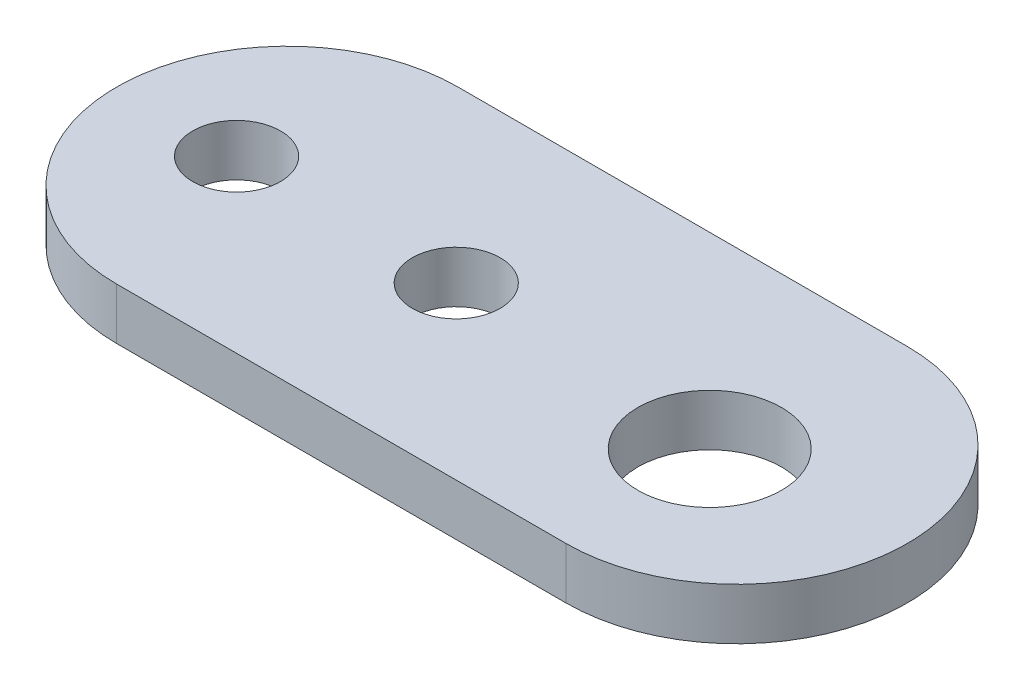
ISO-10303-21;
HEADER;
FILE_DESCRIPTION(('STEP AP214'),'2;1');
FILE_NAME('part.step','',(''),(''),'','','');
FILE_SCHEMA(('AUTOMOTIVE_DESIGN { 1 0 10303 214 1 1 1 1 }'));
ENDSEC;
DATA;
#1=APPLICATION_CONTEXT('core data for automotive mechanical design processes');
#2=APPLICATION_PROTOCOL_DEFINITION('international standard','automotive_design',2000,#1);
#3=PRODUCT_CONTEXT('',#1,'mechanical');
#4=PRODUCT('Part','Part','',(#3));
#5=PRODUCT_RELATED_PRODUCT_CATEGORY('part','',(#4));
#6=PRODUCT_DEFINITION_FORMATION('','',#4);
#7=PRODUCT_DEFINITION_CONTEXT('part definition',#1,'design');
#8=PRODUCT_DEFINITION('design','',#6,#7);
#9=PRODUCT_DEFINITION_SHAPE('','',#8);
#10=(LENGTH_UNIT() NAMED_UNIT(*) SI_UNIT(.MILLI.,.METRE.));
#11=(NAMED_UNIT(*) PLANE_ANGLE_UNIT() SI_UNIT($,.RADIAN.));
#12=(NAMED_UNIT(*) SI_UNIT($,.STERADIAN.) SOLID_ANGLE_UNIT());
#13=UNCERTAINTY_MEASURE_WITH_UNIT(LENGTH_MEASURE(1.E-05),#10,'distance_accuracy_value','');
#14=(GEOMETRIC_REPRESENTATION_CONTEXT(3) GLOBAL_UNCERTAINTY_ASSIGNED_CONTEXT((#13)) GLOBAL_UNIT_ASSIGNED_CONTEXT((#10,
#11,#12)) REPRESENTATION_CONTEXT('',''));
#15=CARTESIAN_POINT('',(0.,0.,0.));
#16=DIRECTION('',(0.,0.,1.));
#17=DIRECTION('',(1.,0.,0.));
#18=AXIS2_PLACEMENT_3D('',#15,#16,#17);
#19=CARTESIAN_POINT('',(13.3,0.,0.));
#20=DIRECTION('',(0.,1.,0.));
#21=DIRECTION('',(1.,0.,0.));
#22=AXIS2_PLACEMENT_3D('',#19,#20,#21);
#23=PLANE('',#22);
#24=CARTESIAN_POINT('',(-3.,0.,0.));
#25=DIRECTION('',(0.,-1.,0.));
#26=DIRECTION('',(1.,0.,0.));
#27=AXIS2_PLACEMENT_3D('',#24,#25,#26);
#28=CIRCLE('',#27,2.6);
#29=CARTESIAN_POINT('',(-5.6,0.,0.));
#30=VERTEX_POINT('',#29);
#31=EDGE_CURVE('E121',#30,#30,#28,.T.);
#32=ORIENTED_EDGE('',*,*,#31,.F.);
#33=EDGE_LOOP('',(#32));
#34=FACE_BOUND('',#33,.T.);
#35=CARTESIAN_POINT('',(10.,0.,0.));
#36=DIRECTION('',(0.,-1.,0.));
#37=DIRECTION('',(1.,0.,0.));
#38=AXIS2_PLACEMENT_3D('',#35,#36,#37);
#39=CIRCLE('',#38,2.6);
#40=CARTESIAN_POINT('',(7.4,0.,0.));
#41=VERTEX_POINT('',#40);
#42=EDGE_CURVE('E116',#41,#41,#39,.T.);
#43=ORIENTED_EDGE('',*,*,#42,.F.);
#44=EDGE_LOOP('',(#43));
#45=FACE_BOUND('',#44,.T.);
#46=CARTESIAN_POINT('',(26.,0.,1.));
#47=DIRECTION('',(0.,-1.,0.));
#48=DIRECTION('',(1.,0.,0.));
#49=AXIS2_PLACEMENT_3D('',#46,#47,#48);
#50=CIRCLE('',#49,4.25);
#51=CARTESIAN_POINT('',(21.75,0.,1.));
#52=VERTEX_POINT('',#51);
#53=EDGE_CURVE('E140',#52,#52,#50,.T.);
#54=ORIENTED_EDGE('',*,*,#53,.F.);
#55=EDGE_LOOP('',(#54));
#56=FACE_BOUND('',#55,.T.);
#57=CARTESIAN_POINT('',(0.,0.,0.));
#58=DIRECTION('',(0.,1.,0.));
#59=DIRECTION('',(0.,0.,-1.));
#60=AXIS2_PLACEMENT_3D('',#57,#58,#59);
#61=CIRCLE('',#60,10.1);
#62=CARTESIAN_POINT('',(0.,0.,-10.1));
#63=VERTEX_POINT('',#62);
#64=CARTESIAN_POINT('',(0.,0.,10.1));
#65=VERTEX_POINT('',#64);
#66=EDGE_CURVE('E27',#63,#65,#61,.T.);
#67=ORIENTED_EDGE('',*,*,#66,.F.);
#68=DIRECTION('',(-1.,0.,0.));
#69=VECTOR('',#68,1.);
#70=CARTESIAN_POINT('',(26.6,0.,-10.1));
#71=LINE('',#70,#69);
#72=CARTESIAN_POINT('',(26.6,0.,-10.1));
#73=VERTEX_POINT('',#72);
#74=EDGE_CURVE('E126',#73,#63,#71,.T.);
#75=ORIENTED_EDGE('',*,*,#74,.F.);
#76=CARTESIAN_POINT('',(26.6,0.,0.));
#77=DIRECTION('',(0.,1.,0.));
#78=DIRECTION('',(0.,0.,1.));
#79=AXIS2_PLACEMENT_3D('',#76,#77,#78);
#80=CIRCLE('',#79,10.1);
#81=CARTESIAN_POINT('',(26.6,0.,10.1));
#82=VERTEX_POINT('',#81);
#83=EDGE_CURVE('E105',#82,#73,#80,.T.);
#84=ORIENTED_EDGE('',*,*,#83,.F.);
#85=DIRECTION('',(1.,0.,0.));
#86=VECTOR('',#85,1.);
#87=CARTESIAN_POINT('',(0.,0.,10.1));
#88=LINE('',#87,#86);
#89=EDGE_CURVE('E89',#65,#82,#88,.T.);
#90=ORIENTED_EDGE('',*,*,#89,.F.);
#91=EDGE_LOOP('',(#67,#75,#84,#90));
#92=FACE_BOUND('',#91,.T.);
#93=ADVANCED_FACE('F16',(#34,#45,#56,#92),#23,.F.);
#94=CARTESIAN_POINT('',(13.3,3.05,0.));
#95=DIRECTION('',(0.,1.,0.));
#96=DIRECTION('',(1.,0.,0.));
#97=AXIS2_PLACEMENT_3D('',#94,#95,#96);
#98=PLANE('',#97);
#99=CARTESIAN_POINT('',(-3.,3.05,0.));
#100=DIRECTION('',(0.,-1.,0.));
#101=DIRECTION('',(1.,0.,0.));
#102=AXIS2_PLACEMENT_3D('',#99,#100,#101);
#103=CIRCLE('',#102,2.6);
#104=CARTESIAN_POINT('',(-5.6,3.05,0.));
#105=VERTEX_POINT('',#104);
#106=EDGE_CURVE('E120',#105,#105,#103,.T.);
#107=ORIENTED_EDGE('',*,*,#106,.T.);
#108=EDGE_LOOP('',(#107));
#109=FACE_BOUND('',#108,.T.);
#110=CARTESIAN_POINT('',(10.,3.05,0.));
#111=DIRECTION('',(0.,-1.,0.));
#112=DIRECTION('',(1.,0.,0.));
#113=AXIS2_PLACEMENT_3D('',#110,#111,#112);
#114=CIRCLE('',#113,2.6);
#115=CARTESIAN_POINT('',(7.4,3.05,0.));
#116=VERTEX_POINT('',#115);
#117=EDGE_CURVE('E144',#116,#116,#114,.T.);
#118=ORIENTED_EDGE('',*,*,#117,.T.);
#119=EDGE_LOOP('',(#118));
#120=FACE_BOUND('',#119,.T.);
#121=CARTESIAN_POINT('',(26.,3.05,1.));
#122=DIRECTION('',(0.,-1.,0.));
#123=DIRECTION('',(1.,0.,0.));
#124=AXIS2_PLACEMENT_3D('',#121,#122,#123);
#125=CIRCLE('',#124,4.25);
#126=CARTESIAN_POINT('',(21.75,3.05,1.));
#127=VERTEX_POINT('',#126);
#128=EDGE_CURVE('E130',#127,#127,#125,.T.);
#129=ORIENTED_EDGE('',*,*,#128,.T.);
#130=EDGE_LOOP('',(#129));
#131=FACE_BOUND('',#130,.T.);
#132=CARTESIAN_POINT('',(0.,3.05,0.));
#133=DIRECTION('',(0.,1.,0.));
#134=DIRECTION('',(0.,0.,-1.));
#135=AXIS2_PLACEMENT_3D('',#132,#133,#134);
#136=CIRCLE('',#135,10.1);
#137=CARTESIAN_POINT('',(0.,3.05,-10.1));
#138=VERTEX_POINT('',#137);
#139=CARTESIAN_POINT('',(0.,3.05,10.1));
#140=VERTEX_POINT('',#139);
#141=EDGE_CURVE('E11',#138,#140,#136,.T.);
#142=ORIENTED_EDGE('',*,*,#141,.T.);
#143=DIRECTION('',(1.,0.,0.));
#144=VECTOR('',#143,1.);
#145=CARTESIAN_POINT('',(0.,3.05,10.1));
#146=LINE('',#145,#144);
#147=CARTESIAN_POINT('',(26.6,3.05,10.1));
#148=VERTEX_POINT('',#147);
#149=EDGE_CURVE('E80',#140,#148,#146,.T.);
#150=ORIENTED_EDGE('',*,*,#149,.T.);
#151=CARTESIAN_POINT('',(26.6,3.05,0.));
#152=DIRECTION('',(0.,1.,0.));
#153=DIRECTION('',(0.,0.,1.));
#154=AXIS2_PLACEMENT_3D('',#151,#152,#153);
#155=CIRCLE('',#154,10.1);
#156=CARTESIAN_POINT('',(26.6,3.05,-10.1));
#157=VERTEX_POINT('',#156);
#158=EDGE_CURVE('E83',#148,#157,#155,.T.);
#159=ORIENTED_EDGE('',*,*,#158,.T.);
#160=DIRECTION('',(-1.,0.,0.));
#161=VECTOR('',#160,1.);
#162=CARTESIAN_POINT('',(26.6,3.05,-10.1));
#163=LINE('',#162,#161);
#164=EDGE_CURVE('E135',#157,#138,#163,.T.);
#165=ORIENTED_EDGE('',*,*,#164,.T.);
#166=EDGE_LOOP('',(#142,#150,#159,#165));
#167=FACE_BOUND('',#166,.T.);
#168=ADVANCED_FACE('F18',(#109,#120,#131,#167),#98,.T.);
#169=CARTESIAN_POINT('',(0.,0.,0.));
#170=DIRECTION('',(0.,1.,0.));
#171=DIRECTION('',(0.,0.,-1.));
#172=AXIS2_PLACEMENT_3D('',#169,#170,#171);
#173=CYLINDRICAL_SURFACE('',#172,10.1);
#174=ORIENTED_EDGE('',*,*,#66,.T.);
#175=DIRECTION('',(0.,1.,0.));
#176=VECTOR('',#175,1.);
#177=CARTESIAN_POINT('',(0.,0.,10.1));
#178=LINE('',#177,#176);
#179=EDGE_CURVE('E88',#65,#140,#178,.T.);
#180=ORIENTED_EDGE('',*,*,#179,.T.);
#181=ORIENTED_EDGE('',*,*,#141,.F.);
#182=DIRECTION('',(0.,1.,0.));
#183=VECTOR('',#182,1.);
#184=CARTESIAN_POINT('',(0.,0.,-10.1));
#185=LINE('',#184,#183);
#186=EDGE_CURVE('E20',#63,#138,#185,.T.);
#187=ORIENTED_EDGE('',*,*,#186,.F.);
#188=EDGE_LOOP('',(#174,#180,#181,#187));
#189=FACE_BOUND('',#188,.T.);
#190=ADVANCED_FACE('F181',(#189),#173,.T.);
#191=CARTESIAN_POINT('',(0.,0.,10.1));
#192=DIRECTION('',(0.,0.,1.));
#193=DIRECTION('',(1.,0.,0.));
#194=AXIS2_PLACEMENT_3D('',#191,#192,#193);
#195=PLANE('',#194);
#196=ORIENTED_EDGE('',*,*,#89,.T.);
#197=DIRECTION('',(0.,1.,0.));
#198=VECTOR('',#197,1.);
#199=CARTESIAN_POINT('',(26.6,0.,10.1));
#200=LINE('',#199,#198);
#201=EDGE_CURVE('E92',#82,#148,#200,.T.);
#202=ORIENTED_EDGE('',*,*,#201,.T.);
#203=ORIENTED_EDGE('',*,*,#149,.F.);
#204=ORIENTED_EDGE('',*,*,#179,.F.);
#205=EDGE_LOOP('',(#196,#202,#203,#204));
#206=FACE_BOUND('',#205,.T.);
#207=ADVANCED_FACE('F93',(#206),#195,.T.);
#208=CARTESIAN_POINT('',(26.6,0.,0.));
#209=DIRECTION('',(0.,1.,0.));
#210=DIRECTION('',(0.,0.,1.));
#211=AXIS2_PLACEMENT_3D('',#208,#209,#210);
#212=CYLINDRICAL_SURFACE('',#211,10.1);
#213=ORIENTED_EDGE('',*,*,#83,.T.);
#214=DIRECTION('',(0.,1.,0.));
#215=VECTOR('',#214,1.);
#216=CARTESIAN_POINT('',(26.6,0.,-10.1));
#217=LINE('',#216,#215);
#218=EDGE_CURVE('E102',#73,#157,#217,.T.);
#219=ORIENTED_EDGE('',*,*,#218,.T.);
#220=ORIENTED_EDGE('',*,*,#158,.F.);
#221=ORIENTED_EDGE('',*,*,#201,.F.);
#222=EDGE_LOOP('',(#213,#219,#220,#221));
#223=FACE_BOUND('',#222,.T.);
#224=ADVANCED_FACE('F100',(#223),#212,.T.);
#225=CARTESIAN_POINT('',(26.6,0.,-10.1));
#226=DIRECTION('',(0.,0.,-1.));
#227=DIRECTION('',(-1.,0.,0.));
#228=AXIS2_PLACEMENT_3D('',#225,#226,#227);
#229=PLANE('',#228);
#230=ORIENTED_EDGE('',*,*,#74,.T.);
#231=ORIENTED_EDGE('',*,*,#186,.T.);
#232=ORIENTED_EDGE('',*,*,#164,.F.);
#233=ORIENTED_EDGE('',*,*,#218,.F.);
#234=EDGE_LOOP('',(#230,#231,#232,#233));
#235=FACE_BOUND('',#234,.T.);
#236=ADVANCED_FACE('F198',(#235),#229,.T.);
#237=CARTESIAN_POINT('',(26.,0.,1.));
#238=DIRECTION('',(0.,1.,0.));
#239=DIRECTION('',(1.,0.,0.));
#240=AXIS2_PLACEMENT_3D('',#237,#238,#239);
#241=CYLINDRICAL_SURFACE('',#240,4.25);
#242=ORIENTED_EDGE('',*,*,#53,.T.);
#243=DIRECTION('',(0.,1.,0.));
#244=VECTOR('',#243,1.);
#245=CARTESIAN_POINT('',(21.75,0.,1.));
#246=LINE('',#245,#244);
#247=EDGE_CURVE('E139',#52,#127,#246,.T.);
#248=ORIENTED_EDGE('',*,*,#247,.T.);
#249=ORIENTED_EDGE('',*,*,#128,.F.);
#250=ORIENTED_EDGE('',*,*,#247,.F.);
#251=EDGE_LOOP('',(#242,#248,#249,#250));
#252=FACE_BOUND('',#251,.T.);
#253=ADVANCED_FACE('F185',(#252),#241,.F.);
#254=CARTESIAN_POINT('',(10.,0.,0.));
#255=DIRECTION('',(0.,1.,0.));
#256=DIRECTION('',(1.,0.,0.));
#257=AXIS2_PLACEMENT_3D('',#254,#255,#256);
#258=CYLINDRICAL_SURFACE('',#257,2.6);
#259=ORIENTED_EDGE('',*,*,#42,.T.);
#260=DIRECTION('',(0.,1.,0.));
#261=VECTOR('',#260,1.);
#262=CARTESIAN_POINT('',(7.4,0.,0.));
#263=LINE('',#262,#261);
#264=EDGE_CURVE('E114',#41,#116,#263,.T.);
#265=ORIENTED_EDGE('',*,*,#264,.T.);
#266=ORIENTED_EDGE('',*,*,#117,.F.);
#267=ORIENTED_EDGE('',*,*,#264,.F.);
#268=EDGE_LOOP('',(#259,#265,#266,#267));
#269=FACE_BOUND('',#268,.T.);
#270=ADVANCED_FACE('F166',(#269),#258,.F.);
#271=CARTESIAN_POINT('',(-3.,0.,0.));
#272=DIRECTION('',(0.,1.,0.));
#273=DIRECTION('',(1.,0.,0.));
#274=AXIS2_PLACEMENT_3D('',#271,#272,#273);
#275=CYLINDRICAL_SURFACE('',#274,2.6);
#276=ORIENTED_EDGE('',*,*,#31,.T.);
#277=DIRECTION('',(0.,1.,0.));
#278=VECTOR('',#277,1.);
#279=CARTESIAN_POINT('',(-5.6,0.,0.));
#280=LINE('',#279,#278);
#281=EDGE_CURVE('E125',#30,#105,#280,.T.);
#282=ORIENTED_EDGE('',*,*,#281,.T.);
#283=ORIENTED_EDGE('',*,*,#106,.F.);
#284=ORIENTED_EDGE('',*,*,#281,.F.);
#285=EDGE_LOOP('',(#276,#282,#283,#284));
#286=FACE_BOUND('',#285,.T.);
#287=ADVANCED_FACE('F177',(#286),#275,.F.);
#288=CLOSED_SHELL('',(#93,#168,#190,#207,#224,#236,#253,#270,#287));
#289=MANIFOLD_SOLID_BREP('B1',#288);
#290=ADVANCED_BREP_SHAPE_REPRESENTATION('',(#18,#289),#14);
#291=SHAPE_DEFINITION_REPRESENTATION(#9,#290);
ENDSEC;
END-ISO-10303-21;
